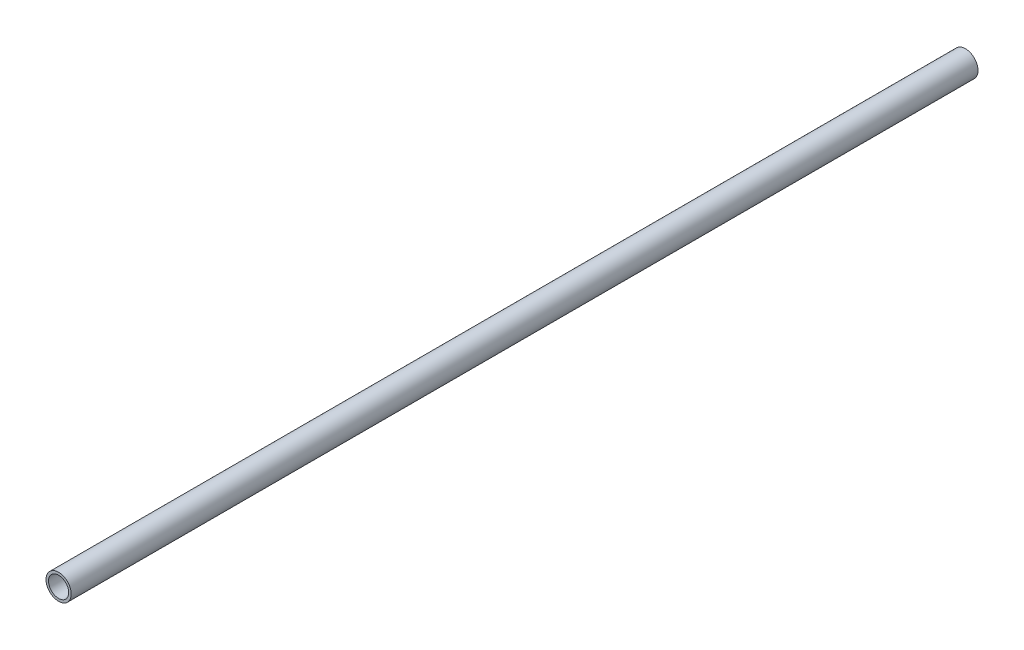
ISO-10303-21;
HEADER;
FILE_DESCRIPTION(('STEP AP214'),'2;1');
FILE_NAME('part.step','',(''),(''),'','','');
FILE_SCHEMA(('AUTOMOTIVE_DESIGN { 1 0 10303 214 1 1 1 1 }'));
ENDSEC;
DATA;
#1=APPLICATION_CONTEXT('core data for automotive mechanical design processes');
#2=APPLICATION_PROTOCOL_DEFINITION('international standard','automotive_design',2000,#1);
#3=PRODUCT_CONTEXT('',#1,'mechanical');
#4=PRODUCT('Part','Part','',(#3));
#5=PRODUCT_RELATED_PRODUCT_CATEGORY('part','',(#4));
#6=PRODUCT_DEFINITION_FORMATION('','',#4);
#7=PRODUCT_DEFINITION_CONTEXT('part definition',#1,'design');
#8=PRODUCT_DEFINITION('design','',#6,#7);
#9=PRODUCT_DEFINITION_SHAPE('','',#8);
#10=(LENGTH_UNIT() NAMED_UNIT(*) SI_UNIT(.MILLI.,.METRE.));
#11=(NAMED_UNIT(*) PLANE_ANGLE_UNIT() SI_UNIT($,.RADIAN.));
#12=(NAMED_UNIT(*) SI_UNIT($,.STERADIAN.) SOLID_ANGLE_UNIT());
#13=UNCERTAINTY_MEASURE_WITH_UNIT(LENGTH_MEASURE(1.E-05),#10,'distance_accuracy_value','');
#14=(GEOMETRIC_REPRESENTATION_CONTEXT(3) GLOBAL_UNCERTAINTY_ASSIGNED_CONTEXT((#13)) GLOBAL_UNIT_ASSIGNED_CONTEXT((#10,
#11,#12)) REPRESENTATION_CONTEXT('',''));
#15=CARTESIAN_POINT('',(0.,0.,0.));
#16=DIRECTION('',(0.,0.,1.));
#17=DIRECTION('',(1.,0.,0.));
#18=AXIS2_PLACEMENT_3D('',#15,#16,#17);
#19=CARTESIAN_POINT('',(0.,0.,360.));
#20=DIRECTION('',(0.,0.,1.));
#21=DIRECTION('',(1.,0.,0.));
#22=AXIS2_PLACEMENT_3D('',#19,#20,#21);
#23=PLANE('',#22);
#24=CARTESIAN_POINT('',(0.,0.,360.));
#25=DIRECTION('',(0.,0.,1.));
#26=DIRECTION('',(1.,0.,0.));
#27=AXIS2_PLACEMENT_3D('',#24,#25,#26);
#28=CIRCLE('',#27,5.);
#29=CARTESIAN_POINT('',(-5.,0.,360.));
#30=VERTEX_POINT('',#29);
#31=EDGE_CURVE('E10',#30,#30,#28,.T.);
#32=ORIENTED_EDGE('',*,*,#31,.T.);
#33=EDGE_LOOP('',(#32));
#34=FACE_BOUND('',#33,.T.);
#35=CARTESIAN_POINT('',(0.,0.,360.));
#36=DIRECTION('',(0.,0.,1.));
#37=DIRECTION('',(1.,0.,0.));
#38=AXIS2_PLACEMENT_3D('',#35,#36,#37);
#39=CIRCLE('',#38,4.);
#40=CARTESIAN_POINT('',(-4.,0.,360.));
#41=VERTEX_POINT('',#40);
#42=EDGE_CURVE('E50',#41,#41,#39,.T.);
#43=ORIENTED_EDGE('',*,*,#42,.F.);
#44=EDGE_LOOP('',(#43));
#45=FACE_BOUND('',#44,.T.);
#46=ADVANCED_FACE('F39',(#34,#45),#23,.T.);
#47=CARTESIAN_POINT('',(0.,0.,0.));
#48=DIRECTION('',(0.,0.,1.));
#49=DIRECTION('',(1.,0.,0.));
#50=AXIS2_PLACEMENT_3D('',#47,#48,#49);
#51=PLANE('',#50);
#52=CARTESIAN_POINT('',(0.,0.,0.));
#53=DIRECTION('',(0.,0.,1.));
#54=DIRECTION('',(1.,0.,0.));
#55=AXIS2_PLACEMENT_3D('',#52,#53,#54);
#56=CIRCLE('',#55,5.);
#57=CARTESIAN_POINT('',(-5.,0.,0.));
#58=VERTEX_POINT('',#57);
#59=EDGE_CURVE('E43',#58,#58,#56,.T.);
#60=ORIENTED_EDGE('',*,*,#59,.F.);
#61=EDGE_LOOP('',(#60));
#62=FACE_BOUND('',#61,.T.);
#63=CARTESIAN_POINT('',(0.,0.,0.));
#64=DIRECTION('',(0.,0.,1.));
#65=DIRECTION('',(1.,0.,0.));
#66=AXIS2_PLACEMENT_3D('',#63,#64,#65);
#67=CIRCLE('',#66,4.);
#68=CARTESIAN_POINT('',(-4.,0.,0.));
#69=VERTEX_POINT('',#68);
#70=EDGE_CURVE('E52',#69,#69,#67,.T.);
#71=ORIENTED_EDGE('',*,*,#70,.T.);
#72=EDGE_LOOP('',(#71));
#73=FACE_BOUND('',#72,.T.);
#74=ADVANCED_FACE('F62',(#62,#73),#51,.F.);
#75=CARTESIAN_POINT('',(0.,0.,360.));
#76=DIRECTION('',(0.,0.,-1.));
#77=DIRECTION('',(-1.,0.,0.));
#78=AXIS2_PLACEMENT_3D('',#75,#76,#77);
#79=CYLINDRICAL_SURFACE('',#78,5.);
#80=CARTESIAN_POINT('',(-5.,0.,360.));
#81=CARTESIAN_POINT('',(-5.,0.,356.25));
#82=CARTESIAN_POINT('',(-5.,0.,352.5));
#83=CARTESIAN_POINT('',(-5.,0.,345.));
#84=CARTESIAN_POINT('',(-5.,0.,341.25));
#85=CARTESIAN_POINT('',(-5.,0.,333.75));
#86=CARTESIAN_POINT('',(-5.,0.,330.));
#87=CARTESIAN_POINT('',(-5.,0.,322.5));
#88=CARTESIAN_POINT('',(-5.,0.,318.75));
#89=CARTESIAN_POINT('',(-5.,0.,311.25));
#90=CARTESIAN_POINT('',(-5.,0.,307.5));
#91=CARTESIAN_POINT('',(-5.,0.,300.));
#92=CARTESIAN_POINT('',(-5.,0.,296.25));
#93=CARTESIAN_POINT('',(-5.,0.,288.75));
#94=CARTESIAN_POINT('',(-5.,0.,285.));
#95=CARTESIAN_POINT('',(-5.,0.,277.5));
#96=CARTESIAN_POINT('',(-5.,0.,273.75));
#97=CARTESIAN_POINT('',(-5.,0.,266.25));
#98=CARTESIAN_POINT('',(-5.,0.,262.5));
#99=CARTESIAN_POINT('',(-5.,0.,255.));
#100=CARTESIAN_POINT('',(-5.,0.,251.25));
#101=CARTESIAN_POINT('',(-5.,0.,243.75));
#102=CARTESIAN_POINT('',(-5.,0.,240.));
#103=CARTESIAN_POINT('',(-5.,0.,232.5));
#104=CARTESIAN_POINT('',(-5.,0.,228.75));
#105=CARTESIAN_POINT('',(-5.,0.,221.25));
#106=CARTESIAN_POINT('',(-5.,0.,217.5));
#107=CARTESIAN_POINT('',(-5.,0.,210.));
#108=CARTESIAN_POINT('',(-5.,0.,206.25));
#109=CARTESIAN_POINT('',(-5.,0.,198.75));
#110=CARTESIAN_POINT('',(-5.,0.,195.));
#111=CARTESIAN_POINT('',(-5.,0.,187.5));
#112=CARTESIAN_POINT('',(-5.,0.,183.75));
#113=CARTESIAN_POINT('',(-5.,0.,176.25));
#114=CARTESIAN_POINT('',(-5.,0.,172.5));
#115=CARTESIAN_POINT('',(-5.,0.,165.));
#116=CARTESIAN_POINT('',(-5.,0.,161.25));
#117=CARTESIAN_POINT('',(-5.,0.,153.75));
#118=CARTESIAN_POINT('',(-5.,0.,150.));
#119=CARTESIAN_POINT('',(-5.,0.,142.5));
#120=CARTESIAN_POINT('',(-5.,0.,138.75));
#121=CARTESIAN_POINT('',(-5.,0.,131.25));
#122=CARTESIAN_POINT('',(-5.,0.,127.5));
#123=CARTESIAN_POINT('',(-5.,0.,120.));
#124=CARTESIAN_POINT('',(-5.,0.,116.25));
#125=CARTESIAN_POINT('',(-5.,0.,108.75));
#126=CARTESIAN_POINT('',(-5.,0.,105.));
#127=CARTESIAN_POINT('',(-5.,0.,97.5));
#128=CARTESIAN_POINT('',(-5.,0.,93.75));
#129=CARTESIAN_POINT('',(-5.,0.,86.25));
#130=CARTESIAN_POINT('',(-5.,0.,82.4999999999999));
#131=CARTESIAN_POINT('',(-5.,0.,74.9999999999999));
#132=CARTESIAN_POINT('',(-5.,0.,71.2499999999999));
#133=CARTESIAN_POINT('',(-5.,0.,63.75));
#134=CARTESIAN_POINT('',(-5.,0.,60.));
#135=CARTESIAN_POINT('',(-5.,0.,52.5));
#136=CARTESIAN_POINT('',(-5.,0.,48.7499999999999));
#137=CARTESIAN_POINT('',(-5.,0.,41.2499999999999));
#138=CARTESIAN_POINT('',(-5.,0.,37.4999999999999));
#139=CARTESIAN_POINT('',(-5.,0.,30.));
#140=CARTESIAN_POINT('',(-5.,0.,26.25));
#141=CARTESIAN_POINT('',(-5.,0.,18.75));
#142=CARTESIAN_POINT('',(-5.,0.,14.9999999999999));
#143=CARTESIAN_POINT('',(-5.,0.,7.49999999999993));
#144=CARTESIAN_POINT('',(-5.,0.,3.74999999999994));
#145=CARTESIAN_POINT('',(-5.,0.,0.));
#146=B_SPLINE_CURVE_WITH_KNOTS('',3,(#80,#81,#82,#83,#84,#85,#86,#87,#88,#89,#90,#91,#92,#93,
#94,#95,#96,#97,#98,#99,#100,#101,#102,#103,#104,#105,#106,#107,#108,#109,#110,#111,#112,#113,
#114,#115,#116,#117,#118,#119,#120,#121,#122,#123,#124,#125,#126,#127,#128,#129,#130,#131,#132,
#133,#134,#135,#136,#137,#138,#139,#140,#141,#142,#143,#144,#145),.UNSPECIFIED.,.F.,.F.,(4,2,2,
2,2,2,2,2,2,2,2,2,2,2,2,2,2,2,2,2,2,2,2,2,2,2,2,2,2,2,2,2,4),(0.,11.25,22.5,33.7499999999999,
45.,56.25,67.4999999999999,78.75,90.,101.25,112.5,123.75,135.,146.25,157.5,168.75,180.,191.25,
202.5,213.75,225.,236.25,247.5,258.75,270.,281.25,292.5,303.75,315.,326.25,337.5,348.75,360.),.UNSPECIFIED.);
#147=EDGE_CURVE('BSEAM41',#30,#58,#146,.T.);
#148=ORIENTED_EDGE('',*,*,#31,.F.);
#149=ORIENTED_EDGE('',*,*,#59,.T.);
#150=ORIENTED_EDGE('',*,*,#147,.T.);
#151=ORIENTED_EDGE('',*,*,#147,.F.);
#152=EDGE_LOOP('',(#148,#150,#149,#151));
#153=FACE_BOUND('',#152,.T.);
#154=ADVANCED_FACE('F41',(#153),#79,.T.);
#155=CARTESIAN_POINT('',(0.,0.,360.));
#156=DIRECTION('',(0.,0.,-1.));
#157=DIRECTION('',(-1.,0.,0.));
#158=AXIS2_PLACEMENT_3D('',#155,#156,#157);
#159=CYLINDRICAL_SURFACE('',#158,4.);
#160=CARTESIAN_POINT('',(-4.,0.,360.));
#161=CARTESIAN_POINT('',(-4.,0.,356.25));
#162=CARTESIAN_POINT('',(-4.,0.,352.5));
#163=CARTESIAN_POINT('',(-4.,0.,345.));
#164=CARTESIAN_POINT('',(-4.,0.,341.25));
#165=CARTESIAN_POINT('',(-4.,0.,333.75));
#166=CARTESIAN_POINT('',(-4.,0.,330.));
#167=CARTESIAN_POINT('',(-4.,0.,322.5));
#168=CARTESIAN_POINT('',(-4.,0.,318.75));
#169=CARTESIAN_POINT('',(-4.,0.,311.25));
#170=CARTESIAN_POINT('',(-4.,0.,307.5));
#171=CARTESIAN_POINT('',(-4.,0.,300.));
#172=CARTESIAN_POINT('',(-4.,0.,296.25));
#173=CARTESIAN_POINT('',(-4.,0.,288.75));
#174=CARTESIAN_POINT('',(-4.,0.,285.));
#175=CARTESIAN_POINT('',(-4.,0.,277.5));
#176=CARTESIAN_POINT('',(-4.,0.,273.75));
#177=CARTESIAN_POINT('',(-4.,0.,266.25));
#178=CARTESIAN_POINT('',(-4.,0.,262.5));
#179=CARTESIAN_POINT('',(-4.,0.,255.));
#180=CARTESIAN_POINT('',(-4.,0.,251.25));
#181=CARTESIAN_POINT('',(-4.,0.,243.75));
#182=CARTESIAN_POINT('',(-4.,0.,240.));
#183=CARTESIAN_POINT('',(-4.,0.,232.5));
#184=CARTESIAN_POINT('',(-4.,0.,228.75));
#185=CARTESIAN_POINT('',(-4.,0.,221.25));
#186=CARTESIAN_POINT('',(-4.,0.,217.5));
#187=CARTESIAN_POINT('',(-4.,0.,210.));
#188=CARTESIAN_POINT('',(-4.,0.,206.25));
#189=CARTESIAN_POINT('',(-4.,0.,198.75));
#190=CARTESIAN_POINT('',(-4.,0.,195.));
#191=CARTESIAN_POINT('',(-4.,0.,187.5));
#192=CARTESIAN_POINT('',(-4.,0.,183.75));
#193=CARTESIAN_POINT('',(-4.,0.,176.25));
#194=CARTESIAN_POINT('',(-4.,0.,172.5));
#195=CARTESIAN_POINT('',(-4.,0.,165.));
#196=CARTESIAN_POINT('',(-4.,0.,161.25));
#197=CARTESIAN_POINT('',(-4.,0.,153.75));
#198=CARTESIAN_POINT('',(-4.,0.,150.));
#199=CARTESIAN_POINT('',(-4.,0.,142.5));
#200=CARTESIAN_POINT('',(-4.,0.,138.75));
#201=CARTESIAN_POINT('',(-4.,0.,131.25));
#202=CARTESIAN_POINT('',(-4.,0.,127.5));
#203=CARTESIAN_POINT('',(-4.,0.,120.));
#204=CARTESIAN_POINT('',(-4.,0.,116.25));
#205=CARTESIAN_POINT('',(-4.,0.,108.75));
#206=CARTESIAN_POINT('',(-4.,0.,105.));
#207=CARTESIAN_POINT('',(-4.,0.,97.5));
#208=CARTESIAN_POINT('',(-4.,0.,93.75));
#209=CARTESIAN_POINT('',(-4.,0.,86.25));
#210=CARTESIAN_POINT('',(-4.,0.,82.5));
#211=CARTESIAN_POINT('',(-4.,0.,75.));
#212=CARTESIAN_POINT('',(-4.,0.,71.25));
#213=CARTESIAN_POINT('',(-4.,0.,63.75));
#214=CARTESIAN_POINT('',(-4.,0.,60.));
#215=CARTESIAN_POINT('',(-4.,0.,52.5));
#216=CARTESIAN_POINT('',(-4.,0.,48.75));
#217=CARTESIAN_POINT('',(-4.,0.,41.25));
#218=CARTESIAN_POINT('',(-4.,0.,37.5));
#219=CARTESIAN_POINT('',(-4.,0.,30.));
#220=CARTESIAN_POINT('',(-4.,0.,26.25));
#221=CARTESIAN_POINT('',(-4.,0.,18.75));
#222=CARTESIAN_POINT('',(-4.,0.,14.9999999999999));
#223=CARTESIAN_POINT('',(-4.,0.,7.49999999999993));
#224=CARTESIAN_POINT('',(-4.,0.,3.74999999999994));
#225=CARTESIAN_POINT('',(-4.,0.,0.));
#226=B_SPLINE_CURVE_WITH_KNOTS('',3,(#160,#161,#162,#163,#164,#165,#166,#167,#168,#169,#170,
#171,#172,#173,#174,#175,#176,#177,#178,#179,#180,#181,#182,#183,#184,#185,#186,#187,#188,#189,
#190,#191,#192,#193,#194,#195,#196,#197,#198,#199,#200,#201,#202,#203,#204,#205,#206,#207,#208,
#209,#210,#211,#212,#213,#214,#215,#216,#217,#218,#219,#220,#221,#222,#223,#224,#225),
.UNSPECIFIED.,.F.,.F.,(4,2,2,2,2,2,2,2,2,2,2,2,2,2,2,2,2,2,2,2,2,2,2,2,2,2,2,2,2,2,2,2,4),(0.,
11.25,22.5,33.7500000000001,45.,56.25,67.5,78.75,90.,101.25,112.5,123.75,135.,146.25,157.5,
168.75,180.,191.25,202.5,213.75,225.,236.25,247.5,258.75,270.,281.25,292.5,303.75,315.,326.25,
337.5,348.75,360.),.UNSPECIFIED.);
#227=EDGE_CURVE('BSEAM58',#41,#69,#226,.T.);
#228=ORIENTED_EDGE('',*,*,#42,.T.);
#229=ORIENTED_EDGE('',*,*,#70,.F.);
#230=ORIENTED_EDGE('',*,*,#227,.T.);
#231=ORIENTED_EDGE('',*,*,#227,.F.);
#232=EDGE_LOOP('',(#228,#230,#229,#231));
#233=FACE_BOUND('',#232,.T.);
#234=ADVANCED_FACE('F58',(#233),#159,.F.);
#235=CLOSED_SHELL('',(#46,#74,#154,#234));
#236=MANIFOLD_SOLID_BREP('B2',#235);
#237=ADVANCED_BREP_SHAPE_REPRESENTATION('',(#18,#236),#14);
#238=SHAPE_DEFINITION_REPRESENTATION(#9,#237);
ENDSEC;
END-ISO-10303-21;
